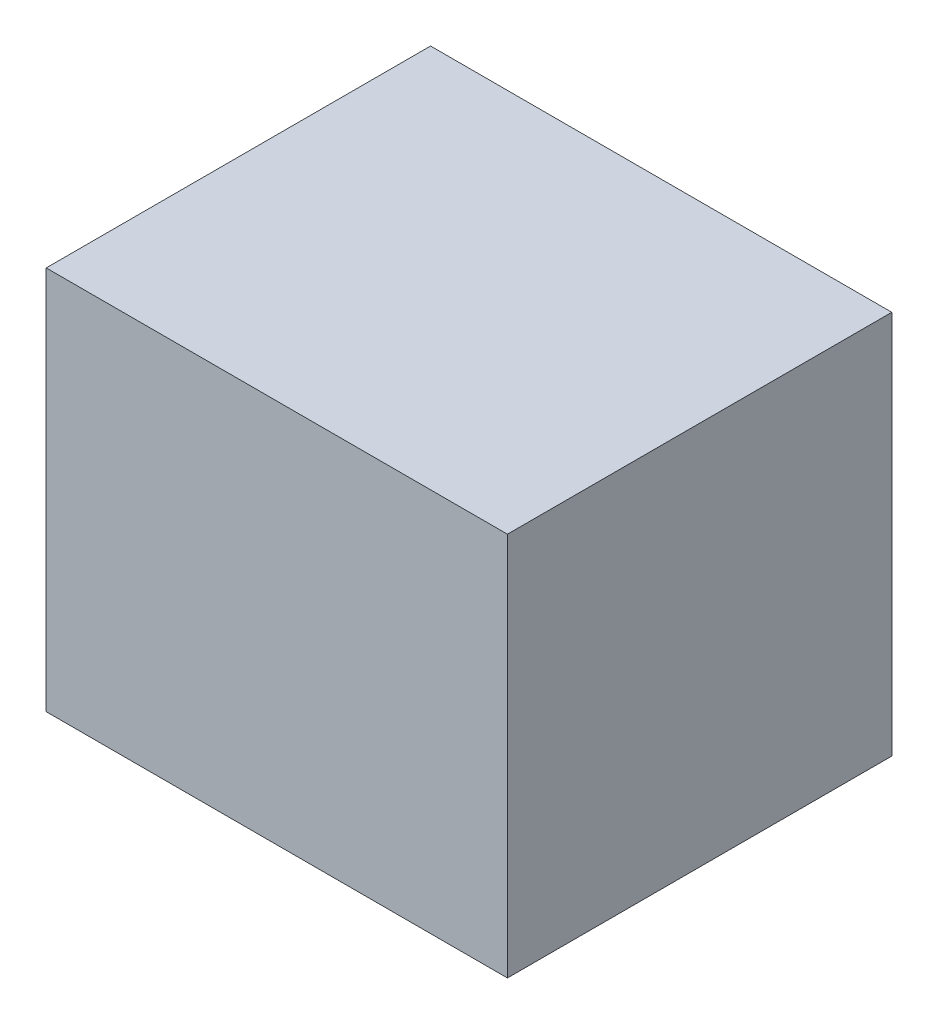
ISO-10303-21;
HEADER;
FILE_DESCRIPTION(('STEP AP214'),'2;1');
FILE_NAME('part.step','',(''),(''),'','','');
FILE_SCHEMA(('AUTOMOTIVE_DESIGN { 1 0 10303 214 1 1 1 1 }'));
ENDSEC;
DATA;
#1=APPLICATION_CONTEXT('core data for automotive mechanical design processes');
#2=APPLICATION_PROTOCOL_DEFINITION('international standard','automotive_design',2000,#1);
#3=PRODUCT_CONTEXT('',#1,'mechanical');
#4=PRODUCT('Part','Part','',(#3));
#5=PRODUCT_RELATED_PRODUCT_CATEGORY('part','',(#4));
#6=PRODUCT_DEFINITION_FORMATION('','',#4);
#7=PRODUCT_DEFINITION_CONTEXT('part definition',#1,'design');
#8=PRODUCT_DEFINITION('design','',#6,#7);
#9=PRODUCT_DEFINITION_SHAPE('','',#8);
#10=(LENGTH_UNIT() NAMED_UNIT(*) SI_UNIT(.MILLI.,.METRE.));
#11=(NAMED_UNIT(*) PLANE_ANGLE_UNIT() SI_UNIT($,.RADIAN.));
#12=(NAMED_UNIT(*) SI_UNIT($,.STERADIAN.) SOLID_ANGLE_UNIT());
#13=UNCERTAINTY_MEASURE_WITH_UNIT(LENGTH_MEASURE(1.E-05),#10,'distance_accuracy_value','');
#14=(GEOMETRIC_REPRESENTATION_CONTEXT(3) GLOBAL_UNCERTAINTY_ASSIGNED_CONTEXT((#13)) GLOBAL_UNIT_ASSIGNED_CONTEXT((#10,
#11,#12)) REPRESENTATION_CONTEXT('',''));
#15=CARTESIAN_POINT('',(0.,0.,0.));
#16=DIRECTION('',(0.,0.,1.));
#17=DIRECTION('',(1.,0.,0.));
#18=AXIS2_PLACEMENT_3D('',#15,#16,#17);
#19=CARTESIAN_POINT('',(0.,0.,500.));
#20=DIRECTION('',(1.,0.,0.));
#21=DIRECTION('',(0.,0.,-1.));
#22=AXIS2_PLACEMENT_3D('',#19,#20,#21);
#23=PLANE('',#22);
#24=DIRECTION('',(0.,-1.,0.));
#25=VECTOR('',#24,1.);
#26=CARTESIAN_POINT('',(0.,0.,0.));
#27=LINE('',#26,#25);
#28=CARTESIAN_POINT('',(0.,500.,0.));
#29=VERTEX_POINT('',#28);
#30=CARTESIAN_POINT('',(0.,0.,0.));
#31=VERTEX_POINT('',#30);
#32=EDGE_CURVE('E113',#29,#31,#27,.T.);
#33=ORIENTED_EDGE('',*,*,#32,.T.);
#34=DIRECTION('',(0.,0.,-1.));
#35=VECTOR('',#34,1.);
#36=CARTESIAN_POINT('',(0.,0.,500.));
#37=LINE('',#36,#35);
#38=CARTESIAN_POINT('',(0.,0.,500.));
#39=VERTEX_POINT('',#38);
#40=EDGE_CURVE('E11',#39,#31,#37,.T.);
#41=ORIENTED_EDGE('',*,*,#40,.F.);
#42=DIRECTION('',(0.,-1.,0.));
#43=VECTOR('',#42,1.);
#44=CARTESIAN_POINT('',(0.,0.,500.));
#45=LINE('',#44,#43);
#46=CARTESIAN_POINT('',(0.,500.,500.));
#47=VERTEX_POINT('',#46);
#48=EDGE_CURVE('E95',#47,#39,#45,.T.);
#49=ORIENTED_EDGE('',*,*,#48,.F.);
#50=DIRECTION('',(0.,0.,-1.));
#51=VECTOR('',#50,1.);
#52=CARTESIAN_POINT('',(0.,500.,500.));
#53=LINE('',#52,#51);
#54=EDGE_CURVE('E109',#47,#29,#53,.T.);
#55=ORIENTED_EDGE('',*,*,#54,.T.);
#56=EDGE_LOOP('',(#33,#41,#49,#55));
#57=FACE_BOUND('',#56,.T.);
#58=ADVANCED_FACE('F43',(#57),#23,.F.);
#59=CARTESIAN_POINT('',(0.,0.,500.));
#60=DIRECTION('',(0.,1.,0.));
#61=DIRECTION('',(0.,0.,1.));
#62=AXIS2_PLACEMENT_3D('',#59,#60,#61);
#63=PLANE('',#62);
#64=DIRECTION('',(1.,0.,0.));
#65=VECTOR('',#64,1.);
#66=CARTESIAN_POINT('',(0.,0.,0.));
#67=LINE('',#66,#65);
#68=CARTESIAN_POINT('',(600.,0.,0.));
#69=VERTEX_POINT('',#68);
#70=EDGE_CURVE('E100',#31,#69,#67,.T.);
#71=ORIENTED_EDGE('',*,*,#70,.T.);
#72=DIRECTION('',(0.,0.,-1.));
#73=VECTOR('',#72,1.);
#74=CARTESIAN_POINT('',(600.,0.,500.));
#75=LINE('',#74,#73);
#76=CARTESIAN_POINT('',(600.,0.,500.));
#77=VERTEX_POINT('',#76);
#78=EDGE_CURVE('E52',#77,#69,#75,.T.);
#79=ORIENTED_EDGE('',*,*,#78,.F.);
#80=DIRECTION('',(1.,0.,0.));
#81=VECTOR('',#80,1.);
#82=CARTESIAN_POINT('',(0.,0.,500.));
#83=LINE('',#82,#81);
#84=EDGE_CURVE('E90',#39,#77,#83,.T.);
#85=ORIENTED_EDGE('',*,*,#84,.F.);
#86=ORIENTED_EDGE('',*,*,#40,.T.);
#87=EDGE_LOOP('',(#71,#79,#85,#86));
#88=FACE_BOUND('',#87,.T.);
#89=ADVANCED_FACE('F99',(#88),#63,.F.);
#90=CARTESIAN_POINT('',(600.,0.,500.));
#91=DIRECTION('',(-1.,0.,0.));
#92=DIRECTION('',(0.,0.,1.));
#93=AXIS2_PLACEMENT_3D('',#90,#91,#92);
#94=PLANE('',#93);
#95=DIRECTION('',(0.,1.,0.));
#96=VECTOR('',#95,1.);
#97=CARTESIAN_POINT('',(600.,0.,0.));
#98=LINE('',#97,#96);
#99=CARTESIAN_POINT('',(600.,500.,0.));
#100=VERTEX_POINT('',#99);
#101=EDGE_CURVE('E77',#69,#100,#98,.T.);
#102=ORIENTED_EDGE('',*,*,#101,.T.);
#103=DIRECTION('',(0.,0.,-1.));
#104=VECTOR('',#103,1.);
#105=CARTESIAN_POINT('',(600.,500.,500.));
#106=LINE('',#105,#104);
#107=CARTESIAN_POINT('',(600.,500.,500.));
#108=VERTEX_POINT('',#107);
#109=EDGE_CURVE('E102',#108,#100,#106,.T.);
#110=ORIENTED_EDGE('',*,*,#109,.F.);
#111=DIRECTION('',(0.,1.,0.));
#112=VECTOR('',#111,1.);
#113=CARTESIAN_POINT('',(600.,0.,500.));
#114=LINE('',#113,#112);
#115=EDGE_CURVE('E93',#77,#108,#114,.T.);
#116=ORIENTED_EDGE('',*,*,#115,.F.);
#117=ORIENTED_EDGE('',*,*,#78,.T.);
#118=EDGE_LOOP('',(#102,#110,#116,#117));
#119=FACE_BOUND('',#118,.T.);
#120=ADVANCED_FACE('F103',(#119),#94,.F.);
#121=CARTESIAN_POINT('',(0.,500.,500.));
#122=DIRECTION('',(0.,-1.,0.));
#123=DIRECTION('',(0.,0.,-1.));
#124=AXIS2_PLACEMENT_3D('',#121,#122,#123);
#125=PLANE('',#124);
#126=DIRECTION('',(-1.,0.,0.));
#127=VECTOR('',#126,1.);
#128=CARTESIAN_POINT('',(0.,500.,0.));
#129=LINE('',#128,#127);
#130=EDGE_CURVE('E83',#100,#29,#129,.T.);
#131=ORIENTED_EDGE('',*,*,#130,.T.);
#132=ORIENTED_EDGE('',*,*,#54,.F.);
#133=DIRECTION('',(-1.,0.,0.));
#134=VECTOR('',#133,1.);
#135=CARTESIAN_POINT('',(0.,500.,500.));
#136=LINE('',#135,#134);
#137=EDGE_CURVE('E60',#108,#47,#136,.T.);
#138=ORIENTED_EDGE('',*,*,#137,.F.);
#139=ORIENTED_EDGE('',*,*,#109,.T.);
#140=EDGE_LOOP('',(#131,#132,#138,#139));
#141=FACE_BOUND('',#140,.T.);
#142=ADVANCED_FACE('F128',(#141),#125,.F.);
#143=CARTESIAN_POINT('',(0.,0.,500.));
#144=DIRECTION('',(0.,0.,-1.));
#145=DIRECTION('',(-1.,0.,0.));
#146=AXIS2_PLACEMENT_3D('',#143,#144,#145);
#147=PLANE('',#146);
#148=ORIENTED_EDGE('',*,*,#48,.T.);
#149=ORIENTED_EDGE('',*,*,#84,.T.);
#150=ORIENTED_EDGE('',*,*,#115,.T.);
#151=ORIENTED_EDGE('',*,*,#137,.T.);
#152=EDGE_LOOP('',(#148,#149,#150,#151));
#153=FACE_BOUND('',#152,.T.);
#154=ADVANCED_FACE('F91',(#153),#147,.F.);
#155=CARTESIAN_POINT('',(0.,0.,0.));
#156=DIRECTION('',(0.,0.,-1.));
#157=DIRECTION('',(-1.,0.,0.));
#158=AXIS2_PLACEMENT_3D('',#155,#156,#157);
#159=PLANE('',#158);
#160=ORIENTED_EDGE('',*,*,#32,.F.);
#161=ORIENTED_EDGE('',*,*,#130,.F.);
#162=ORIENTED_EDGE('',*,*,#101,.F.);
#163=ORIENTED_EDGE('',*,*,#70,.F.);
#164=EDGE_LOOP('',(#160,#161,#162,#163));
#165=FACE_BOUND('',#164,.T.);
#166=ADVANCED_FACE('F131',(#165),#159,.T.);
#167=CLOSED_SHELL('',(#58,#89,#120,#142,#154,#166));
#168=MANIFOLD_SOLID_BREP('B2',#167);
#169=ADVANCED_BREP_SHAPE_REPRESENTATION('',(#18,#168),#14);
#170=SHAPE_DEFINITION_REPRESENTATION(#9,#169);
ENDSEC;
END-ISO-10303-21;
